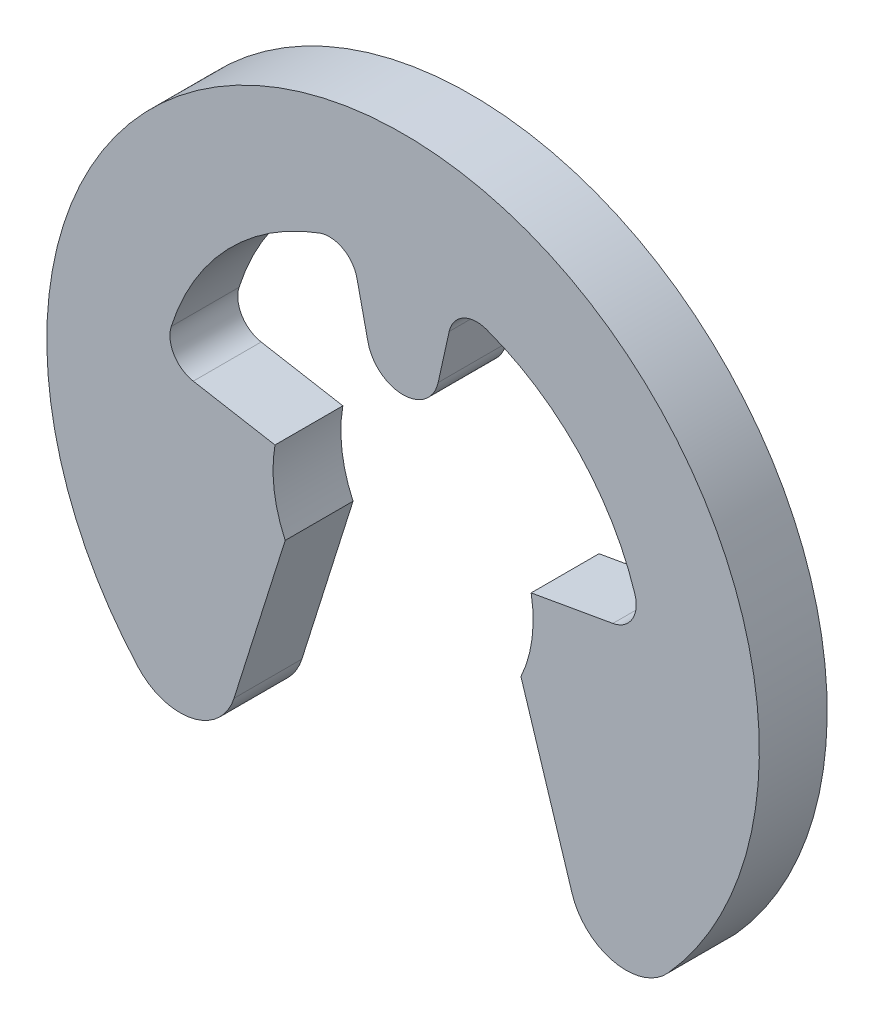
ISO-10303-21;
HEADER;
FILE_DESCRIPTION(('STEP AP214'),'2;1');
FILE_NAME('part.step','',(''),(''),'','','');
FILE_SCHEMA(('AUTOMOTIVE_DESIGN { 1 0 10303 214 1 1 1 1 }'));
ENDSEC;
DATA;
#1=APPLICATION_CONTEXT('core data for automotive mechanical design processes');
#2=APPLICATION_PROTOCOL_DEFINITION('international standard','automotive_design',2000,#1);
#3=PRODUCT_CONTEXT('',#1,'mechanical');
#4=PRODUCT('Part','Part','',(#3));
#5=PRODUCT_RELATED_PRODUCT_CATEGORY('part','',(#4));
#6=PRODUCT_DEFINITION_FORMATION('','',#4);
#7=PRODUCT_DEFINITION_CONTEXT('part definition',#1,'design');
#8=PRODUCT_DEFINITION('design','',#6,#7);
#9=PRODUCT_DEFINITION_SHAPE('','',#8);
#10=(LENGTH_UNIT() NAMED_UNIT(*) SI_UNIT(.MILLI.,.METRE.));
#11=(NAMED_UNIT(*) PLANE_ANGLE_UNIT() SI_UNIT($,.RADIAN.));
#12=(NAMED_UNIT(*) SI_UNIT($,.STERADIAN.) SOLID_ANGLE_UNIT());
#13=UNCERTAINTY_MEASURE_WITH_UNIT(LENGTH_MEASURE(1.E-05),#10,'distance_accuracy_value','');
#14=(GEOMETRIC_REPRESENTATION_CONTEXT(3) GLOBAL_UNCERTAINTY_ASSIGNED_CONTEXT((#13)) GLOBAL_UNIT_ASSIGNED_CONTEXT((#10,
#11,#12)) REPRESENTATION_CONTEXT('',''));
#15=CARTESIAN_POINT('',(0.,0.,0.));
#16=DIRECTION('',(0.,0.,1.));
#17=DIRECTION('',(1.,0.,0.));
#18=AXIS2_PLACEMENT_3D('',#15,#16,#17);
#19=CARTESIAN_POINT('',(0.,0.,-0.6));
#20=DIRECTION('',(0.,0.,1.));
#21=DIRECTION('',(1.,0.,0.));
#22=AXIS2_PLACEMENT_3D('',#19,#20,#21);
#23=CYLINDRICAL_SURFACE('',#22,1.15);
#24=CARTESIAN_POINT('',(0.,0.,0.));
#25=DIRECTION('',(0.,0.,-1.));
#26=DIRECTION('',(1.,0.,0.));
#27=AXIS2_PLACEMENT_3D('',#24,#25,#26);
#28=CIRCLE('',#27,1.15);
#29=CARTESIAN_POINT('',(1.13252891596404,0.199695404316966,0.));
#30=VERTEX_POINT('',#29);
#31=CARTESIAN_POINT('',(1.04225395509215,-0.486011001001809,0.));
#32=VERTEX_POINT('',#31);
#33=EDGE_CURVE('E190',#30,#32,#28,.T.);
#34=ORIENTED_EDGE('',*,*,#33,.F.);
#35=DIRECTION('',(0.,0.,1.));
#36=VECTOR('',#35,1.);
#37=CARTESIAN_POINT('',(1.13252891596404,0.199695404316966,-0.6));
#38=LINE('',#37,#36);
#39=CARTESIAN_POINT('',(1.13252891596404,0.199695404316966,-0.6));
#40=VERTEX_POINT('',#39);
#41=EDGE_CURVE('E11',#40,#30,#38,.T.);
#42=ORIENTED_EDGE('',*,*,#41,.F.);
#43=CARTESIAN_POINT('',(0.,0.,-0.6));
#44=DIRECTION('',(0.,0.,-1.));
#45=DIRECTION('',(1.,0.,0.));
#46=AXIS2_PLACEMENT_3D('',#43,#44,#45);
#47=CIRCLE('',#46,1.15);
#48=CARTESIAN_POINT('',(1.04225395509215,-0.486011001001809,-0.6));
#49=VERTEX_POINT('',#48);
#50=EDGE_CURVE('E240',#40,#49,#47,.T.);
#51=ORIENTED_EDGE('',*,*,#50,.T.);
#52=DIRECTION('',(0.,0.,1.));
#53=VECTOR('',#52,1.);
#54=CARTESIAN_POINT('',(1.04225395509215,-0.486011001001809,-0.6));
#55=LINE('',#54,#53);
#56=EDGE_CURVE('E36',#49,#32,#55,.T.);
#57=ORIENTED_EDGE('',*,*,#56,.T.);
#58=EDGE_LOOP('',(#34,#42,#51,#57));
#59=FACE_BOUND('',#58,.T.);
#60=ADVANCED_FACE('F33',(#59),#23,.F.);
#61=CARTESIAN_POINT('',(1.13252891596404,0.199695404316966,-0.6));
#62=DIRECTION('',(-0.173648177666928,0.984807753012209,0.));
#63=DIRECTION('',(-0.984807753012209,-0.173648177666928,0.));
#64=AXIS2_PLACEMENT_3D('',#61,#62,#63);
#65=PLANE('',#64);
#66=DIRECTION('',(-0.984807753012209,-0.173648177666928,0.));
#67=VECTOR('',#66,1.);
#68=CARTESIAN_POINT('',(1.13252891596404,0.199695404316966,0.));
#69=LINE('',#68,#67);
#70=CARTESIAN_POINT('',(1.85486651436674,0.327063012095516,0.));
#71=VERTEX_POINT('',#70);
#72=EDGE_CURVE('E238',#71,#30,#69,.T.);
#73=ORIENTED_EDGE('',*,*,#72,.F.);
#74=DIRECTION('',(0.,0.,1.));
#75=VECTOR('',#74,1.);
#76=CARTESIAN_POINT('',(1.85486651436674,0.327063012095516,-0.6));
#77=LINE('',#76,#75);
#78=CARTESIAN_POINT('',(1.85486651436674,0.327063012095516,-0.6));
#79=VERTEX_POINT('',#78);
#80=EDGE_CURVE('E42',#79,#71,#77,.T.);
#81=ORIENTED_EDGE('',*,*,#80,.F.);
#82=DIRECTION('',(-0.984807753012209,-0.173648177666928,0.));
#83=VECTOR('',#82,1.);
#84=CARTESIAN_POINT('',(1.13252891596404,0.199695404316966,-0.6));
#85=LINE('',#84,#83);
#86=EDGE_CURVE('E180',#79,#40,#85,.T.);
#87=ORIENTED_EDGE('',*,*,#86,.T.);
#88=ORIENTED_EDGE('',*,*,#41,.T.);
#89=EDGE_LOOP('',(#73,#81,#87,#88));
#90=FACE_BOUND('',#89,.T.);
#91=ADVANCED_FACE('F272',(#90),#65,.T.);
#92=CARTESIAN_POINT('',(1.81145446995001,0.573264950348568,-0.6));
#93=DIRECTION('',(0.,0.,1.));
#94=DIRECTION('',(1.,0.,0.));
#95=AXIS2_PLACEMENT_3D('',#92,#93,#94);
#96=CYLINDRICAL_SURFACE('',#95,0.25);
#97=CARTESIAN_POINT('',(1.81145446995001,0.573264950348568,0.));
#98=DIRECTION('',(0.,0.,-1.));
#99=DIRECTION('',(1.,0.,0.));
#100=AXIS2_PLACEMENT_3D('',#97,#98,#99);
#101=CIRCLE('',#100,0.25);
#102=CARTESIAN_POINT('',(2.04980374231185,0.648694549078642,0.));
#103=VERTEX_POINT('',#102);
#104=EDGE_CURVE('E167',#103,#71,#101,.T.);
#105=ORIENTED_EDGE('',*,*,#104,.F.);
#106=DIRECTION('',(0.,0.,1.));
#107=VECTOR('',#106,1.);
#108=CARTESIAN_POINT('',(2.04980374231185,0.648694549078642,-0.6));
#109=LINE('',#108,#107);
#110=CARTESIAN_POINT('',(2.04980374231185,0.648694549078642,-0.6));
#111=VERTEX_POINT('',#110);
#112=EDGE_CURVE('E162',#111,#103,#109,.T.);
#113=ORIENTED_EDGE('',*,*,#112,.F.);
#114=CARTESIAN_POINT('',(1.81145446995001,0.573264950348568,-0.6));
#115=DIRECTION('',(0.,0.,-1.));
#116=DIRECTION('',(1.,0.,0.));
#117=AXIS2_PLACEMENT_3D('',#114,#115,#116);
#118=CIRCLE('',#117,0.25);
#119=EDGE_CURVE('E165',#111,#79,#118,.T.);
#120=ORIENTED_EDGE('',*,*,#119,.T.);
#121=ORIENTED_EDGE('',*,*,#80,.T.);
#122=EDGE_LOOP('',(#105,#113,#120,#121));
#123=FACE_BOUND('',#122,.T.);
#124=ADVANCED_FACE('F164',(#123),#96,.F.);
#125=CARTESIAN_POINT('',(0.,0.,-0.6));
#126=DIRECTION('',(0.,0.,1.));
#127=DIRECTION('',(1.,0.,0.));
#128=AXIS2_PLACEMENT_3D('',#125,#126,#127);
#129=CYLINDRICAL_SURFACE('',#128,2.15);
#130=CARTESIAN_POINT('',(0.,0.,0.));
#131=DIRECTION('',(0.,0.,-1.));
#132=DIRECTION('',(1.,0.,0.));
#133=AXIS2_PLACEMENT_3D('',#130,#131,#132);
#134=CIRCLE('',#133,2.15);
#135=CARTESIAN_POINT('',(0.737488319065687,2.01955712453044,0.));
#136=VERTEX_POINT('',#135);
#137=EDGE_CURVE('E235',#136,#103,#134,.T.);
#138=ORIENTED_EDGE('',*,*,#137,.F.);
#139=DIRECTION('',(0.,0.,1.));
#140=VECTOR('',#139,1.);
#141=CARTESIAN_POINT('',(0.737488319065687,2.01955712453044,-0.6));
#142=LINE('',#141,#140);
#143=CARTESIAN_POINT('',(0.737488319065687,2.01955712453044,-0.6));
#144=VERTEX_POINT('',#143);
#145=EDGE_CURVE('E172',#144,#136,#142,.T.);
#146=ORIENTED_EDGE('',*,*,#145,.F.);
#147=CARTESIAN_POINT('',(0.,0.,-0.6));
#148=DIRECTION('',(0.,0.,-1.));
#149=DIRECTION('',(1.,0.,0.));
#150=AXIS2_PLACEMENT_3D('',#147,#148,#149);
#151=CIRCLE('',#150,2.15);
#152=EDGE_CURVE('E178',#144,#111,#151,.T.);
#153=ORIENTED_EDGE('',*,*,#152,.T.);
#154=ORIENTED_EDGE('',*,*,#112,.T.);
#155=EDGE_LOOP('',(#138,#146,#153,#154));
#156=FACE_BOUND('',#155,.T.);
#157=ADVANCED_FACE('F182',(#156),#129,.F.);
#158=CARTESIAN_POINT('',(0.651733863360374,1.78472490074783,-0.6));
#159=DIRECTION('',(0.,0.,1.));
#160=DIRECTION('',(1.,0.,0.));
#161=AXIS2_PLACEMENT_3D('',#158,#159,#160);
#162=CYLINDRICAL_SURFACE('',#161,0.25);
#163=CARTESIAN_POINT('',(0.651733863360374,1.78472490074783,0.));
#164=DIRECTION('',(0.,0.,-1.));
#165=DIRECTION('',(1.,0.,0.));
#166=AXIS2_PLACEMENT_3D('',#163,#164,#165);
#167=CIRCLE('',#166,0.25);
#168=CARTESIAN_POINT('',(0.407659861580391,1.83883480423236,0.));
#169=VERTEX_POINT('',#168);
#170=EDGE_CURVE('E232',#169,#136,#167,.T.);
#171=ORIENTED_EDGE('',*,*,#170,.F.);
#172=DIRECTION('',(0.,0.,1.));
#173=VECTOR('',#172,1.);
#174=CARTESIAN_POINT('',(0.407659861580391,1.83883480423236,-0.6));
#175=LINE('',#174,#173);
#176=CARTESIAN_POINT('',(0.407659861580391,1.83883480423236,-0.6));
#177=VERTEX_POINT('',#176);
#178=EDGE_CURVE('E244',#177,#169,#175,.T.);
#179=ORIENTED_EDGE('',*,*,#178,.F.);
#180=CARTESIAN_POINT('',(0.651733863360374,1.78472490074783,-0.6));
#181=DIRECTION('',(0.,0.,-1.));
#182=DIRECTION('',(1.,0.,0.));
#183=AXIS2_PLACEMENT_3D('',#180,#181,#182);
#184=CIRCLE('',#183,0.25);
#185=EDGE_CURVE('E183',#177,#144,#184,.T.);
#186=ORIENTED_EDGE('',*,*,#185,.T.);
#187=ORIENTED_EDGE('',*,*,#145,.T.);
#188=EDGE_LOOP('',(#171,#179,#186,#187));
#189=FACE_BOUND('',#188,.T.);
#190=ADVANCED_FACE('F285',(#189),#162,.F.);
#191=CARTESIAN_POINT('',(0.310129895313144,1.39890555602881,-0.6));
#192=DIRECTION('',(0.976296007119933,-0.216439613938103,0.));
#193=DIRECTION('',(0.216439613938103,0.976296007119933,0.));
#194=AXIS2_PLACEMENT_3D('',#191,#192,#193);
#195=PLANE('',#194);
#196=DIRECTION('',(0.216439613938103,0.976296007119933,0.));
#197=VECTOR('',#196,1.);
#198=CARTESIAN_POINT('',(0.310129895313144,1.39890555602881,0.));
#199=LINE('',#198,#197);
#200=CARTESIAN_POINT('',(0.310129895313144,1.39890555602881,0.));
#201=VERTEX_POINT('',#200);
#202=EDGE_CURVE('E229',#201,#169,#199,.T.);
#203=ORIENTED_EDGE('',*,*,#202,.F.);
#204=DIRECTION('',(0.,0.,1.));
#205=VECTOR('',#204,1.);
#206=CARTESIAN_POINT('',(0.310129895313144,1.39890555602881,-0.6));
#207=LINE('',#206,#205);
#208=CARTESIAN_POINT('',(0.310129895313144,1.39890555602881,-0.6));
#209=VERTEX_POINT('',#208);
#210=EDGE_CURVE('E246',#209,#201,#207,.T.);
#211=ORIENTED_EDGE('',*,*,#210,.F.);
#212=DIRECTION('',(0.216439613938103,0.976296007119933,0.));
#213=VECTOR('',#212,1.);
#214=CARTESIAN_POINT('',(0.310129895313144,1.39890555602881,-0.6));
#215=LINE('',#214,#213);
#216=EDGE_CURVE('E185',#209,#177,#215,.T.);
#217=ORIENTED_EDGE('',*,*,#216,.T.);
#218=ORIENTED_EDGE('',*,*,#178,.T.);
#219=EDGE_LOOP('',(#203,#211,#217,#218));
#220=FACE_BOUND('',#219,.T.);
#221=ADVANCED_FACE('F288',(#220),#195,.T.);
#222=CARTESIAN_POINT('',(0.,1.46765969854575,-0.6));
#223=DIRECTION('',(0.,0.,1.));
#224=DIRECTION('',(1.,0.,0.));
#225=AXIS2_PLACEMENT_3D('',#222,#223,#224);
#226=CYLINDRICAL_SURFACE('',#225,0.317659698545757);
#227=CARTESIAN_POINT('',(0.,1.46765969854575,0.));
#228=DIRECTION('',(0.,0.,1.));
#229=DIRECTION('',(1.,0.,0.));
#230=AXIS2_PLACEMENT_3D('',#227,#228,#229);
#231=CIRCLE('',#230,0.317659698545757);
#232=CARTESIAN_POINT('',(-0.310129895313144,1.39890555602881,0.));
#233=VERTEX_POINT('',#232);
#234=EDGE_CURVE('E226',#233,#201,#231,.T.);
#235=ORIENTED_EDGE('',*,*,#234,.F.);
#236=DIRECTION('',(0.,0.,1.));
#237=VECTOR('',#236,1.);
#238=CARTESIAN_POINT('',(-0.310129895313144,1.39890555602881,-0.6));
#239=LINE('',#238,#237);
#240=CARTESIAN_POINT('',(-0.310129895313144,1.39890555602881,-0.6));
#241=VERTEX_POINT('',#240);
#242=EDGE_CURVE('E248',#241,#233,#239,.T.);
#243=ORIENTED_EDGE('',*,*,#242,.F.);
#244=CARTESIAN_POINT('',(0.,1.46765969854575,-0.6));
#245=DIRECTION('',(0.,0.,1.));
#246=DIRECTION('',(1.,0.,0.));
#247=AXIS2_PLACEMENT_3D('',#244,#245,#246);
#248=CIRCLE('',#247,0.317659698545757);
#249=EDGE_CURVE('E496',#241,#209,#248,.T.);
#250=ORIENTED_EDGE('',*,*,#249,.T.);
#251=ORIENTED_EDGE('',*,*,#210,.T.);
#252=EDGE_LOOP('',(#235,#243,#250,#251));
#253=FACE_BOUND('',#252,.T.);
#254=ADVANCED_FACE('F292',(#253),#226,.T.);
#255=CARTESIAN_POINT('',(-0.310129895313144,1.39890555602881,-0.6));
#256=DIRECTION('',(-0.976296007119933,-0.216439613938103,0.));
#257=DIRECTION('',(0.216439613938103,-0.976296007119933,0.));
#258=AXIS2_PLACEMENT_3D('',#255,#256,#257);
#259=PLANE('',#258);
#260=DIRECTION('',(0.216439613938103,-0.976296007119933,0.));
#261=VECTOR('',#260,1.);
#262=CARTESIAN_POINT('',(-0.310129895313144,1.39890555602881,0.));
#263=LINE('',#262,#261);
#264=CARTESIAN_POINT('',(-0.407659861580391,1.83883480423236,0.));
#265=VERTEX_POINT('',#264);
#266=EDGE_CURVE('E223',#265,#233,#263,.T.);
#267=ORIENTED_EDGE('',*,*,#266,.F.);
#268=DIRECTION('',(0.,0.,1.));
#269=VECTOR('',#268,1.);
#270=CARTESIAN_POINT('',(-0.407659861580391,1.83883480423236,-0.6));
#271=LINE('',#270,#269);
#272=CARTESIAN_POINT('',(-0.407659861580391,1.83883480423236,-0.6));
#273=VERTEX_POINT('',#272);
#274=EDGE_CURVE('E250',#273,#265,#271,.T.);
#275=ORIENTED_EDGE('',*,*,#274,.F.);
#276=DIRECTION('',(0.216439613938103,-0.976296007119933,0.));
#277=VECTOR('',#276,1.);
#278=CARTESIAN_POINT('',(-0.310129895313144,1.39890555602881,-0.6));
#279=LINE('',#278,#277);
#280=EDGE_CURVE('E500',#273,#241,#279,.T.);
#281=ORIENTED_EDGE('',*,*,#280,.T.);
#282=ORIENTED_EDGE('',*,*,#242,.T.);
#283=EDGE_LOOP('',(#267,#275,#281,#282));
#284=FACE_BOUND('',#283,.T.);
#285=ADVANCED_FACE('F296',(#284),#259,.T.);
#286=CARTESIAN_POINT('',(-0.651733863360374,1.78472490074783,-0.6));
#287=DIRECTION('',(0.,0.,1.));
#288=DIRECTION('',(1.,0.,0.));
#289=AXIS2_PLACEMENT_3D('',#286,#287,#288);
#290=CYLINDRICAL_SURFACE('',#289,0.25);
#291=CARTESIAN_POINT('',(-0.651733863360374,1.78472490074783,0.));
#292=DIRECTION('',(0.,0.,-1.));
#293=DIRECTION('',(1.,0.,0.));
#294=AXIS2_PLACEMENT_3D('',#291,#292,#293);
#295=CIRCLE('',#294,0.25);
#296=CARTESIAN_POINT('',(-0.737488319065687,2.01955712453044,0.));
#297=VERTEX_POINT('',#296);
#298=EDGE_CURVE('E220',#297,#265,#295,.T.);
#299=ORIENTED_EDGE('',*,*,#298,.F.);
#300=DIRECTION('',(0.,0.,1.));
#301=VECTOR('',#300,1.);
#302=CARTESIAN_POINT('',(-0.737488319065687,2.01955712453044,-0.6));
#303=LINE('',#302,#301);
#304=CARTESIAN_POINT('',(-0.737488319065687,2.01955712453044,-0.6));
#305=VERTEX_POINT('',#304);
#306=EDGE_CURVE('E252',#305,#297,#303,.T.);
#307=ORIENTED_EDGE('',*,*,#306,.F.);
#308=CARTESIAN_POINT('',(-0.651733863360374,1.78472490074783,-0.6));
#309=DIRECTION('',(0.,0.,-1.));
#310=DIRECTION('',(1.,0.,0.));
#311=AXIS2_PLACEMENT_3D('',#308,#309,#310);
#312=CIRCLE('',#311,0.25);
#313=EDGE_CURVE('E489',#305,#273,#312,.T.);
#314=ORIENTED_EDGE('',*,*,#313,.T.);
#315=ORIENTED_EDGE('',*,*,#274,.T.);
#316=EDGE_LOOP('',(#299,#307,#314,#315));
#317=FACE_BOUND('',#316,.T.);
#318=ADVANCED_FACE('F300',(#317),#290,.F.);
#319=CARTESIAN_POINT('',(0.,0.,-0.6));
#320=DIRECTION('',(0.,0.,1.));
#321=DIRECTION('',(1.,0.,0.));
#322=AXIS2_PLACEMENT_3D('',#319,#320,#321);
#323=CYLINDRICAL_SURFACE('',#322,2.15);
#324=CARTESIAN_POINT('',(0.,0.,0.));
#325=DIRECTION('',(0.,0.,-1.));
#326=DIRECTION('',(1.,0.,0.));
#327=AXIS2_PLACEMENT_3D('',#324,#325,#326);
#328=CIRCLE('',#327,2.15);
#329=CARTESIAN_POINT('',(-2.04980374231185,0.648694549078642,0.));
#330=VERTEX_POINT('',#329);
#331=EDGE_CURVE('E217',#330,#297,#328,.T.);
#332=ORIENTED_EDGE('',*,*,#331,.F.);
#333=DIRECTION('',(0.,0.,1.));
#334=VECTOR('',#333,1.);
#335=CARTESIAN_POINT('',(-2.04980374231185,0.648694549078642,-0.6));
#336=LINE('',#335,#334);
#337=CARTESIAN_POINT('',(-2.04980374231185,0.648694549078642,-0.6));
#338=VERTEX_POINT('',#337);
#339=EDGE_CURVE('E254',#338,#330,#336,.T.);
#340=ORIENTED_EDGE('',*,*,#339,.F.);
#341=CARTESIAN_POINT('',(0.,0.,-0.6));
#342=DIRECTION('',(0.,0.,-1.));
#343=DIRECTION('',(1.,0.,0.));
#344=AXIS2_PLACEMENT_3D('',#341,#342,#343);
#345=CIRCLE('',#344,2.15);
#346=EDGE_CURVE('E485',#338,#305,#345,.T.);
#347=ORIENTED_EDGE('',*,*,#346,.T.);
#348=ORIENTED_EDGE('',*,*,#306,.T.);
#349=EDGE_LOOP('',(#332,#340,#347,#348));
#350=FACE_BOUND('',#349,.T.);
#351=ADVANCED_FACE('F304',(#350),#323,.F.);
#352=CARTESIAN_POINT('',(-1.81145446995001,0.573264950348568,-0.6));
#353=DIRECTION('',(0.,0.,1.));
#354=DIRECTION('',(1.,0.,0.));
#355=AXIS2_PLACEMENT_3D('',#352,#353,#354);
#356=CYLINDRICAL_SURFACE('',#355,0.25);
#357=CARTESIAN_POINT('',(-1.81145446995001,0.573264950348568,0.));
#358=DIRECTION('',(0.,0.,-1.));
#359=DIRECTION('',(1.,0.,0.));
#360=AXIS2_PLACEMENT_3D('',#357,#358,#359);
#361=CIRCLE('',#360,0.25);
#362=CARTESIAN_POINT('',(-1.85486651436674,0.327063012095515,0.));
#363=VERTEX_POINT('',#362);
#364=EDGE_CURVE('E214',#363,#330,#361,.T.);
#365=ORIENTED_EDGE('',*,*,#364,.F.);
#366=DIRECTION('',(0.,0.,1.));
#367=VECTOR('',#366,1.);
#368=CARTESIAN_POINT('',(-1.85486651436674,0.327063012095515,-0.6));
#369=LINE('',#368,#367);
#370=CARTESIAN_POINT('',(-1.85486651436674,0.327063012095515,-0.6));
#371=VERTEX_POINT('',#370);
#372=EDGE_CURVE('E256',#371,#363,#369,.T.);
#373=ORIENTED_EDGE('',*,*,#372,.F.);
#374=CARTESIAN_POINT('',(-1.81145446995001,0.573264950348568,-0.6));
#375=DIRECTION('',(0.,0.,-1.));
#376=DIRECTION('',(1.,0.,0.));
#377=AXIS2_PLACEMENT_3D('',#374,#375,#376);
#378=CIRCLE('',#377,0.25);
#379=EDGE_CURVE('E506',#371,#338,#378,.T.);
#380=ORIENTED_EDGE('',*,*,#379,.T.);
#381=ORIENTED_EDGE('',*,*,#339,.T.);
#382=EDGE_LOOP('',(#365,#373,#380,#381));
#383=FACE_BOUND('',#382,.T.);
#384=ADVANCED_FACE('F308',(#383),#356,.F.);
#385=CARTESIAN_POINT('',(-1.13252891596404,0.199695404316966,-0.6));
#386=DIRECTION('',(0.173648177666928,0.984807753012209,0.));
#387=DIRECTION('',(-0.984807753012209,0.173648177666928,0.));
#388=AXIS2_PLACEMENT_3D('',#385,#386,#387);
#389=PLANE('',#388);
#390=DIRECTION('',(-0.984807753012209,0.173648177666928,0.));
#391=VECTOR('',#390,1.);
#392=CARTESIAN_POINT('',(-1.13252891596404,0.199695404316966,0.));
#393=LINE('',#392,#391);
#394=CARTESIAN_POINT('',(-1.13252891596404,0.199695404316966,0.));
#395=VERTEX_POINT('',#394);
#396=EDGE_CURVE('E211',#395,#363,#393,.T.);
#397=ORIENTED_EDGE('',*,*,#396,.F.);
#398=DIRECTION('',(0.,0.,1.));
#399=VECTOR('',#398,1.);
#400=CARTESIAN_POINT('',(-1.13252891596404,0.199695404316966,-0.6));
#401=LINE('',#400,#399);
#402=CARTESIAN_POINT('',(-1.13252891596404,0.199695404316966,-0.6));
#403=VERTEX_POINT('',#402);
#404=EDGE_CURVE('E258',#403,#395,#401,.T.);
#405=ORIENTED_EDGE('',*,*,#404,.F.);
#406=DIRECTION('',(-0.984807753012209,0.173648177666928,0.));
#407=VECTOR('',#406,1.);
#408=CARTESIAN_POINT('',(-1.13252891596404,0.199695404316966,-0.6));
#409=LINE('',#408,#407);
#410=EDGE_CURVE('E478',#403,#371,#409,.T.);
#411=ORIENTED_EDGE('',*,*,#410,.T.);
#412=ORIENTED_EDGE('',*,*,#372,.T.);
#413=EDGE_LOOP('',(#397,#405,#411,#412));
#414=FACE_BOUND('',#413,.T.);
#415=ADVANCED_FACE('F312',(#414),#389,.T.);
#416=CARTESIAN_POINT('',(0.,0.,-0.6));
#417=DIRECTION('',(0.,0.,1.));
#418=DIRECTION('',(1.,0.,0.));
#419=AXIS2_PLACEMENT_3D('',#416,#417,#418);
#420=CYLINDRICAL_SURFACE('',#419,1.15);
#421=CARTESIAN_POINT('',(0.,0.,0.));
#422=DIRECTION('',(0.,0.,-1.));
#423=DIRECTION('',(1.,0.,0.));
#424=AXIS2_PLACEMENT_3D('',#421,#422,#423);
#425=CIRCLE('',#424,1.15);
#426=CARTESIAN_POINT('',(-1.04225395509215,-0.486011001001808,0.));
#427=VERTEX_POINT('',#426);
#428=EDGE_CURVE('E208',#427,#395,#425,.T.);
#429=ORIENTED_EDGE('',*,*,#428,.F.);
#430=DIRECTION('',(0.,0.,1.));
#431=VECTOR('',#430,1.);
#432=CARTESIAN_POINT('',(-1.04225395509215,-0.486011001001808,-0.6));
#433=LINE('',#432,#431);
#434=CARTESIAN_POINT('',(-1.04225395509215,-0.486011001001808,-0.6));
#435=VERTEX_POINT('',#434);
#436=EDGE_CURVE('E260',#435,#427,#433,.T.);
#437=ORIENTED_EDGE('',*,*,#436,.F.);
#438=CARTESIAN_POINT('',(0.,0.,-0.6));
#439=DIRECTION('',(0.,0.,-1.));
#440=DIRECTION('',(1.,0.,0.));
#441=AXIS2_PLACEMENT_3D('',#438,#439,#440);
#442=CIRCLE('',#441,1.15);
#443=EDGE_CURVE('E474',#435,#403,#442,.T.);
#444=ORIENTED_EDGE('',*,*,#443,.T.);
#445=ORIENTED_EDGE('',*,*,#404,.T.);
#446=EDGE_LOOP('',(#429,#437,#444,#445));
#447=FACE_BOUND('',#446,.T.);
#448=ADVANCED_FACE('F316',(#447),#420,.F.);
#449=CARTESIAN_POINT('',(-1.04225395509215,-0.486011001001809,-0.6));
#450=DIRECTION('',(0.953716950748227,-0.300705799504274,0.));
#451=DIRECTION('',(0.300705799504274,0.953716950748227,0.));
#452=AXIS2_PLACEMENT_3D('',#449,#450,#451);
#453=PLANE('',#452);
#454=DIRECTION('',(0.300705799504274,0.953716950748227,0.));
#455=VECTOR('',#454,1.);
#456=CARTESIAN_POINT('',(-1.04225395509215,-0.486011001001809,0.));
#457=LINE('',#456,#455);
#458=CARTESIAN_POINT('',(-1.49472067518231,-1.9210520986821,0.));
#459=VERTEX_POINT('',#458);
#460=EDGE_CURVE('E205',#459,#427,#457,.T.);
#461=ORIENTED_EDGE('',*,*,#460,.F.);
#462=DIRECTION('',(0.,0.,1.));
#463=VECTOR('',#462,1.);
#464=CARTESIAN_POINT('',(-1.49472067518231,-1.9210520986821,-0.6));
#465=LINE('',#464,#463);
#466=CARTESIAN_POINT('',(-1.49472067518231,-1.9210520986821,-0.6));
#467=VERTEX_POINT('',#466);
#468=EDGE_CURVE('E262',#467,#459,#465,.T.);
#469=ORIENTED_EDGE('',*,*,#468,.F.);
#470=DIRECTION('',(0.300705799504274,0.953716950748227,0.));
#471=VECTOR('',#470,1.);
#472=CARTESIAN_POINT('',(-1.04225395509215,-0.486011001001809,-0.6));
#473=LINE('',#472,#471);
#474=EDGE_CURVE('E510',#467,#435,#473,.T.);
#475=ORIENTED_EDGE('',*,*,#474,.T.);
#476=ORIENTED_EDGE('',*,*,#436,.T.);
#477=EDGE_LOOP('',(#461,#469,#475,#476));
#478=FACE_BOUND('',#477,.T.);
#479=ADVANCED_FACE('F320',(#478),#453,.T.);
#480=CARTESIAN_POINT('',(-1.97157915055642,-1.77069919892996,-0.6));
#481=DIRECTION('',(0.,0.,1.));
#482=DIRECTION('',(1.,0.,0.));
#483=AXIS2_PLACEMENT_3D('',#480,#481,#482);
#484=CYLINDRICAL_SURFACE('',#483,0.5);
#485=CARTESIAN_POINT('',(-1.97157915055642,-1.77069919892996,0.));
#486=DIRECTION('',(0.,0.,1.));
#487=DIRECTION('',(1.,0.,0.));
#488=AXIS2_PLACEMENT_3D('',#485,#486,#487);
#489=CIRCLE('',#488,0.5);
#490=CARTESIAN_POINT('',(-2.34357521669914,-2.10479338740732,0.));
#491=VERTEX_POINT('',#490);
#492=EDGE_CURVE('E202',#491,#459,#489,.T.);
#493=ORIENTED_EDGE('',*,*,#492,.F.);
#494=DIRECTION('',(0.,0.,1.));
#495=VECTOR('',#494,1.);
#496=CARTESIAN_POINT('',(-2.34357521669914,-2.10479338740732,-0.6));
#497=LINE('',#496,#495);
#498=CARTESIAN_POINT('',(-2.34357521669914,-2.10479338740732,-0.6));
#499=VERTEX_POINT('',#498);
#500=EDGE_CURVE('E264',#499,#491,#497,.T.);
#501=ORIENTED_EDGE('',*,*,#500,.F.);
#502=CARTESIAN_POINT('',(-1.97157915055642,-1.77069919892996,-0.6));
#503=DIRECTION('',(0.,0.,1.));
#504=DIRECTION('',(1.,0.,0.));
#505=AXIS2_PLACEMENT_3D('',#502,#503,#504);
#506=CIRCLE('',#505,0.5);
#507=EDGE_CURVE('E467',#499,#467,#506,.T.);
#508=ORIENTED_EDGE('',*,*,#507,.T.);
#509=ORIENTED_EDGE('',*,*,#468,.T.);
#510=EDGE_LOOP('',(#493,#501,#508,#509));
#511=FACE_BOUND('',#510,.T.);
#512=ADVANCED_FACE('F324',(#511),#484,.T.);
#513=CARTESIAN_POINT('',(0.,0.,-0.6));
#514=DIRECTION('',(0.,0.,1.));
#515=DIRECTION('',(1.,0.,0.));
#516=AXIS2_PLACEMENT_3D('',#513,#514,#515);
#517=CYLINDRICAL_SURFACE('',#516,3.15);
#518=CARTESIAN_POINT('',(0.,0.,0.));
#519=DIRECTION('',(0.,0.,1.));
#520=DIRECTION('',(1.,0.,0.));
#521=AXIS2_PLACEMENT_3D('',#518,#519,#520);
#522=CIRCLE('',#521,3.15);
#523=CARTESIAN_POINT('',(2.34357521669914,-2.10479338740732,0.));
#524=VERTEX_POINT('',#523);
#525=EDGE_CURVE('E199',#524,#491,#522,.T.);
#526=ORIENTED_EDGE('',*,*,#525,.F.);
#527=DIRECTION('',(0.,0.,1.));
#528=VECTOR('',#527,1.);
#529=CARTESIAN_POINT('',(2.34357521669914,-2.10479338740732,-0.6));
#530=LINE('',#529,#528);
#531=CARTESIAN_POINT('',(2.34357521669914,-2.10479338740732,-0.6));
#532=VERTEX_POINT('',#531);
#533=EDGE_CURVE('E266',#532,#524,#530,.T.);
#534=ORIENTED_EDGE('',*,*,#533,.F.);
#535=CARTESIAN_POINT('',(0.,0.,-0.6));
#536=DIRECTION('',(0.,0.,1.));
#537=DIRECTION('',(1.,0.,0.));
#538=AXIS2_PLACEMENT_3D('',#535,#536,#537);
#539=CIRCLE('',#538,3.15);
#540=EDGE_CURVE('E463',#532,#499,#539,.T.);
#541=ORIENTED_EDGE('',*,*,#540,.T.);
#542=ORIENTED_EDGE('',*,*,#500,.T.);
#543=EDGE_LOOP('',(#526,#534,#541,#542));
#544=FACE_BOUND('',#543,.T.);
#545=ADVANCED_FACE('F328',(#544),#517,.T.);
#546=CARTESIAN_POINT('',(1.97157915055642,-1.77069919892996,-0.6));
#547=DIRECTION('',(0.,0.,1.));
#548=DIRECTION('',(1.,0.,0.));
#549=AXIS2_PLACEMENT_3D('',#546,#547,#548);
#550=CYLINDRICAL_SURFACE('',#549,0.5);
#551=CARTESIAN_POINT('',(1.97157915055642,-1.77069919892996,0.));
#552=DIRECTION('',(0.,0.,1.));
#553=DIRECTION('',(1.,0.,0.));
#554=AXIS2_PLACEMENT_3D('',#551,#552,#553);
#555=CIRCLE('',#554,0.5);
#556=CARTESIAN_POINT('',(1.49472067518231,-1.9210520986821,0.));
#557=VERTEX_POINT('',#556);
#558=EDGE_CURVE('E196',#557,#524,#555,.T.);
#559=ORIENTED_EDGE('',*,*,#558,.F.);
#560=DIRECTION('',(0.,0.,1.));
#561=VECTOR('',#560,1.);
#562=CARTESIAN_POINT('',(1.49472067518231,-1.9210520986821,-0.6));
#563=LINE('',#562,#561);
#564=CARTESIAN_POINT('',(1.49472067518231,-1.9210520986821,-0.6));
#565=VERTEX_POINT('',#564);
#566=EDGE_CURVE('E267',#565,#557,#563,.T.);
#567=ORIENTED_EDGE('',*,*,#566,.F.);
#568=CARTESIAN_POINT('',(1.97157915055642,-1.77069919892996,-0.6));
#569=DIRECTION('',(0.,0.,1.));
#570=DIRECTION('',(1.,0.,0.));
#571=AXIS2_PLACEMENT_3D('',#568,#569,#570);
#572=CIRCLE('',#571,0.5);
#573=EDGE_CURVE('E514',#565,#532,#572,.T.);
#574=ORIENTED_EDGE('',*,*,#573,.T.);
#575=ORIENTED_EDGE('',*,*,#533,.T.);
#576=EDGE_LOOP('',(#559,#567,#574,#575));
#577=FACE_BOUND('',#576,.T.);
#578=ADVANCED_FACE('F332',(#577),#550,.T.);
#579=CARTESIAN_POINT('',(1.04225395509215,-0.486011001001809,-0.6));
#580=DIRECTION('',(-0.953716950748227,-0.300705799504274,0.));
#581=DIRECTION('',(0.300705799504274,-0.953716950748227,0.));
#582=AXIS2_PLACEMENT_3D('',#579,#580,#581);
#583=PLANE('',#582);
#584=DIRECTION('',(0.300705799504274,-0.953716950748227,0.));
#585=VECTOR('',#584,1.);
#586=CARTESIAN_POINT('',(1.04225395509215,-0.486011001001809,0.));
#587=LINE('',#586,#585);
#588=EDGE_CURVE('E193',#32,#557,#587,.T.);
#589=ORIENTED_EDGE('',*,*,#588,.F.);
#590=ORIENTED_EDGE('',*,*,#56,.F.);
#591=DIRECTION('',(0.300705799504274,-0.953716950748227,0.));
#592=VECTOR('',#591,1.);
#593=CARTESIAN_POINT('',(1.04225395509215,-0.486011001001809,-0.6));
#594=LINE('',#593,#592);
#595=EDGE_CURVE('E516',#49,#565,#594,.T.);
#596=ORIENTED_EDGE('',*,*,#595,.T.);
#597=ORIENTED_EDGE('',*,*,#566,.T.);
#598=EDGE_LOOP('',(#589,#590,#596,#597));
#599=FACE_BOUND('',#598,.T.);
#600=ADVANCED_FACE('F269',(#599),#583,.T.);
#601=CARTESIAN_POINT('',(0.,0.,-0.6));
#602=DIRECTION('',(0.,0.,1.));
#603=DIRECTION('',(1.,0.,0.));
#604=AXIS2_PLACEMENT_3D('',#601,#602,#603);
#605=PLANE('',#604);
#606=ORIENTED_EDGE('',*,*,#50,.F.);
#607=ORIENTED_EDGE('',*,*,#86,.F.);
#608=ORIENTED_EDGE('',*,*,#119,.F.);
#609=ORIENTED_EDGE('',*,*,#152,.F.);
#610=ORIENTED_EDGE('',*,*,#185,.F.);
#611=ORIENTED_EDGE('',*,*,#216,.F.);
#612=ORIENTED_EDGE('',*,*,#249,.F.);
#613=ORIENTED_EDGE('',*,*,#280,.F.);
#614=ORIENTED_EDGE('',*,*,#313,.F.);
#615=ORIENTED_EDGE('',*,*,#346,.F.);
#616=ORIENTED_EDGE('',*,*,#379,.F.);
#617=ORIENTED_EDGE('',*,*,#410,.F.);
#618=ORIENTED_EDGE('',*,*,#443,.F.);
#619=ORIENTED_EDGE('',*,*,#474,.F.);
#620=ORIENTED_EDGE('',*,*,#507,.F.);
#621=ORIENTED_EDGE('',*,*,#540,.F.);
#622=ORIENTED_EDGE('',*,*,#573,.F.);
#623=ORIENTED_EDGE('',*,*,#595,.F.);
#624=EDGE_LOOP('',(#606,#607,#608,#609,#610,#611,#612,#613,#614,#615,#616,#617,#618,#619,#620,
#621,#622,#623));
#625=FACE_BOUND('',#624,.T.);
#626=ADVANCED_FACE('F176',(#625),#605,.F.);
#627=CARTESIAN_POINT('',(0.,0.,0.));
#628=DIRECTION('',(0.,0.,1.));
#629=DIRECTION('',(1.,0.,0.));
#630=AXIS2_PLACEMENT_3D('',#627,#628,#629);
#631=PLANE('',#630);
#632=ORIENTED_EDGE('',*,*,#33,.T.);
#633=ORIENTED_EDGE('',*,*,#588,.T.);
#634=ORIENTED_EDGE('',*,*,#558,.T.);
#635=ORIENTED_EDGE('',*,*,#525,.T.);
#636=ORIENTED_EDGE('',*,*,#492,.T.);
#637=ORIENTED_EDGE('',*,*,#460,.T.);
#638=ORIENTED_EDGE('',*,*,#428,.T.);
#639=ORIENTED_EDGE('',*,*,#396,.T.);
#640=ORIENTED_EDGE('',*,*,#364,.T.);
#641=ORIENTED_EDGE('',*,*,#331,.T.);
#642=ORIENTED_EDGE('',*,*,#298,.T.);
#643=ORIENTED_EDGE('',*,*,#266,.T.);
#644=ORIENTED_EDGE('',*,*,#234,.T.);
#645=ORIENTED_EDGE('',*,*,#202,.T.);
#646=ORIENTED_EDGE('',*,*,#170,.T.);
#647=ORIENTED_EDGE('',*,*,#137,.T.);
#648=ORIENTED_EDGE('',*,*,#104,.T.);
#649=ORIENTED_EDGE('',*,*,#72,.T.);
#650=EDGE_LOOP('',(#632,#633,#634,#635,#636,#637,#638,#639,#640,#641,#642,#643,#644,#645,#646,
#647,#648,#649));
#651=FACE_BOUND('',#650,.T.);
#652=ADVANCED_FACE('F271',(#651),#631,.T.);
#653=CLOSED_SHELL('',(#60,#91,#124,#157,#190,#221,#254,#285,#318,#351,#384,#415,#448,#479,#512,
#545,#578,#600,#626,#652));
#654=MANIFOLD_SOLID_BREP('B2',#653);
#655=ADVANCED_BREP_SHAPE_REPRESENTATION('',(#18,#654),#14);
#656=SHAPE_DEFINITION_REPRESENTATION(#9,#655);
ENDSEC;
END-ISO-10303-21;
